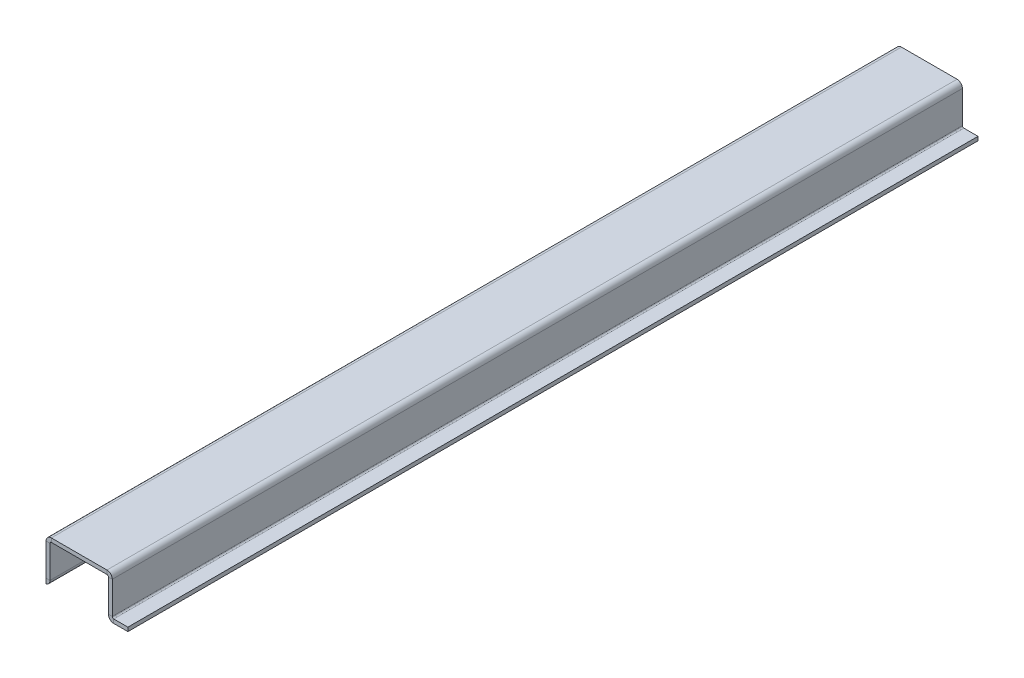
ISO-10303-21;
HEADER;
FILE_DESCRIPTION(('STEP AP214'),'2;1');
FILE_NAME('part.step','',(''),(''),'','','');
FILE_SCHEMA(('AUTOMOTIVE_DESIGN { 1 0 10303 214 1 1 1 1 }'));
ENDSEC;
DATA;
#1=APPLICATION_CONTEXT('core data for automotive mechanical design processes');
#2=APPLICATION_PROTOCOL_DEFINITION('international standard','automotive_design',2000,#1);
#3=PRODUCT_CONTEXT('',#1,'mechanical');
#4=PRODUCT('Part','Part','',(#3));
#5=PRODUCT_RELATED_PRODUCT_CATEGORY('part','',(#4));
#6=PRODUCT_DEFINITION_FORMATION('','',#4);
#7=PRODUCT_DEFINITION_CONTEXT('part definition',#1,'design');
#8=PRODUCT_DEFINITION('design','',#6,#7);
#9=PRODUCT_DEFINITION_SHAPE('','',#8);
#10=(LENGTH_UNIT() NAMED_UNIT(*) SI_UNIT(.MILLI.,.METRE.));
#11=(NAMED_UNIT(*) PLANE_ANGLE_UNIT() SI_UNIT($,.RADIAN.));
#12=(NAMED_UNIT(*) SI_UNIT($,.STERADIAN.) SOLID_ANGLE_UNIT());
#13=UNCERTAINTY_MEASURE_WITH_UNIT(LENGTH_MEASURE(1.E-05),#10,'distance_accuracy_value','');
#14=(GEOMETRIC_REPRESENTATION_CONTEXT(3) GLOBAL_UNCERTAINTY_ASSIGNED_CONTEXT((#13)) GLOBAL_UNIT_ASSIGNED_CONTEXT((#10,
#11,#12)) REPRESENTATION_CONTEXT('',''));
#15=CARTESIAN_POINT('',(0.,0.,0.));
#16=DIRECTION('',(0.,0.,1.));
#17=DIRECTION('',(1.,0.,0.));
#18=AXIS2_PLACEMENT_3D('',#15,#16,#17);
#19=CARTESIAN_POINT('',(0.,2.,436.));
#20=DIRECTION('',(0.,-1.,0.));
#21=DIRECTION('',(1.,0.,0.));
#22=AXIS2_PLACEMENT_3D('',#19,#20,#21);
#23=PLANE('',#22);
#24=DIRECTION('',(-1.,0.,0.));
#25=VECTOR('',#24,1.);
#26=CARTESIAN_POINT('',(0.,2.,360.));
#27=LINE('',#26,#25);
#28=CARTESIAN_POINT('',(-2.7366,2.,360.));
#29=VERTEX_POINT('',#28);
#30=CARTESIAN_POINT('',(-10.,2.,360.));
#31=VERTEX_POINT('',#30);
#32=EDGE_CURVE('E204',#29,#31,#27,.T.);
#33=ORIENTED_EDGE('',*,*,#32,.F.);
#34=DIRECTION('',(0.,0.,-1.));
#35=VECTOR('',#34,1.);
#36=CARTESIAN_POINT('',(-2.7366,2.,436.));
#37=LINE('',#36,#35);
#38=CARTESIAN_POINT('',(-2.7366,2.,76.));
#39=VERTEX_POINT('',#38);
#40=EDGE_CURVE('E203',#29,#39,#37,.T.);
#41=ORIENTED_EDGE('',*,*,#40,.T.);
#42=DIRECTION('',(1.,0.,0.));
#43=VECTOR('',#42,1.);
#44=CARTESIAN_POINT('',(3.88761203946308E-13,2.,76.));
#45=LINE('',#44,#43);
#46=CARTESIAN_POINT('',(-10.,2.,76.));
#47=VERTEX_POINT('',#46);
#48=EDGE_CURVE('E300',#47,#39,#45,.T.);
#49=ORIENTED_EDGE('',*,*,#48,.F.);
#50=DIRECTION('',(0.,0.,-1.));
#51=VECTOR('',#50,1.);
#52=CARTESIAN_POINT('',(-10.,2.,436.));
#53=LINE('',#52,#51);
#54=EDGE_CURVE('E262',#31,#47,#53,.T.);
#55=ORIENTED_EDGE('',*,*,#54,.F.);
#56=EDGE_LOOP('',(#33,#41,#49,#55));
#57=FACE_BOUND('',#56,.T.);
#58=ADVANCED_FACE('F38',(#57),#23,.F.);
#59=CARTESIAN_POINT('',(-10.,0.,436.));
#60=DIRECTION('',(-1.,0.,0.));
#61=DIRECTION('',(0.,0.,1.));
#62=AXIS2_PLACEMENT_3D('',#59,#60,#61);
#63=PLANE('',#62);
#64=DIRECTION('',(0.,0.,-1.));
#65=VECTOR('',#64,1.);
#66=CARTESIAN_POINT('',(-10.,0.,436.));
#67=LINE('',#66,#65);
#68=CARTESIAN_POINT('',(-10.,0.,360.));
#69=VERTEX_POINT('',#68);
#70=CARTESIAN_POINT('',(-10.,0.,76.));
#71=VERTEX_POINT('',#70);
#72=EDGE_CURVE('E260',#69,#71,#67,.T.);
#73=ORIENTED_EDGE('',*,*,#72,.F.);
#74=DIRECTION('',(0.,1.,0.));
#75=VECTOR('',#74,1.);
#76=CARTESIAN_POINT('',(-10.,0.,360.));
#77=LINE('',#76,#75);
#78=EDGE_CURVE('E906',#69,#31,#77,.T.);
#79=ORIENTED_EDGE('',*,*,#78,.T.);
#80=ORIENTED_EDGE('',*,*,#54,.T.);
#81=DIRECTION('',(0.,-1.,0.));
#82=VECTOR('',#81,1.);
#83=CARTESIAN_POINT('',(-10.,0.,76.));
#84=LINE('',#83,#82);
#85=EDGE_CURVE('E302',#47,#71,#84,.T.);
#86=ORIENTED_EDGE('',*,*,#85,.T.);
#87=EDGE_LOOP('',(#73,#79,#80,#86));
#88=FACE_BOUND('',#87,.T.);
#89=ADVANCED_FACE('F519',(#88),#63,.T.);
#90=CARTESIAN_POINT('',(0.,0.,436.));
#91=DIRECTION('',(0.,-1.,0.));
#92=DIRECTION('',(1.,0.,0.));
#93=AXIS2_PLACEMENT_3D('',#90,#91,#92);
#94=PLANE('',#93);
#95=DIRECTION('',(0.,0.,-1.));
#96=VECTOR('',#95,1.);
#97=CARTESIAN_POINT('',(-2.7366,0.,436.));
#98=LINE('',#97,#96);
#99=CARTESIAN_POINT('',(-2.7366,0.,360.));
#100=VERTEX_POINT('',#99);
#101=CARTESIAN_POINT('',(-2.7366,0.,76.));
#102=VERTEX_POINT('',#101);
#103=EDGE_CURVE('E258',#100,#102,#98,.T.);
#104=ORIENTED_EDGE('',*,*,#103,.F.);
#105=DIRECTION('',(-1.,0.,0.));
#106=VECTOR('',#105,1.);
#107=CARTESIAN_POINT('',(0.,0.,360.));
#108=LINE('',#107,#106);
#109=EDGE_CURVE('E903',#100,#69,#108,.T.);
#110=ORIENTED_EDGE('',*,*,#109,.T.);
#111=ORIENTED_EDGE('',*,*,#72,.T.);
#112=DIRECTION('',(1.,0.,0.));
#113=VECTOR('',#112,1.);
#114=CARTESIAN_POINT('',(3.89006133306138E-13,0.,76.));
#115=LINE('',#114,#113);
#116=EDGE_CURVE('E307',#71,#102,#115,.T.);
#117=ORIENTED_EDGE('',*,*,#116,.T.);
#118=EDGE_LOOP('',(#104,#110,#111,#117));
#119=FACE_BOUND('',#118,.T.);
#120=ADVANCED_FACE('F525',(#119),#94,.T.);
#121=CARTESIAN_POINT('',(-2.7366,2.7366,436.));
#122=DIRECTION('',(0.,0.,-1.));
#123=DIRECTION('',(-1.,0.,0.));
#124=AXIS2_PLACEMENT_3D('',#121,#122,#123);
#125=CYLINDRICAL_SURFACE('',#124,2.7366);
#126=CARTESIAN_POINT('',(-2.7366,2.7366,436.));
#127=DIRECTION('',(0.,0.,1.));
#128=DIRECTION('',(1.,0.,0.));
#129=AXIS2_PLACEMENT_3D('',#126,#127,#128);
#130=CIRCLE('',#129,2.7366);
#131=CARTESIAN_POINT('',(0.,2.7366,436.));
#132=VERTEX_POINT('',#131);
#133=CARTESIAN_POINT('',(-2.,0.100997602065136,436.));
#134=VERTEX_POINT('',#133);
#135=EDGE_CURVE('E319',#132,#134,#130,.F.);
#136=ORIENTED_EDGE('',*,*,#135,.T.);
#137=DIRECTION('',(0.,0.,-1.));
#138=VECTOR('',#137,1.);
#139=CARTESIAN_POINT('',(-2.,0.100997602065136,436.));
#140=LINE('',#139,#138);
#141=CARTESIAN_POINT('',(-2.,0.100997602065137,360.));
#142=VERTEX_POINT('',#141);
#143=EDGE_CURVE('E53',#134,#142,#140,.T.);
#144=ORIENTED_EDGE('',*,*,#143,.T.);
#145=CARTESIAN_POINT('',(-2.7366,2.7366,360.));
#146=DIRECTION('',(0.,0.,1.));
#147=DIRECTION('',(1.,0.,0.));
#148=AXIS2_PLACEMENT_3D('',#145,#146,#147);
#149=CIRCLE('',#148,2.7366);
#150=EDGE_CURVE('E199',#142,#100,#149,.F.);
#151=ORIENTED_EDGE('',*,*,#150,.T.);
#152=ORIENTED_EDGE('',*,*,#103,.T.);
#153=CARTESIAN_POINT('',(-2.7366,2.7366,76.));
#154=DIRECTION('',(0.,0.,-1.));
#155=DIRECTION('',(-1.,0.,0.));
#156=AXIS2_PLACEMENT_3D('',#153,#154,#155);
#157=CIRCLE('',#156,2.7366);
#158=CARTESIAN_POINT('',(-2.,0.100997602065131,76.));
#159=VERTEX_POINT('',#158);
#160=EDGE_CURVE('E316',#102,#159,#157,.F.);
#161=ORIENTED_EDGE('',*,*,#160,.T.);
#162=DIRECTION('',(0.,0.,-1.));
#163=VECTOR('',#162,1.);
#164=CARTESIAN_POINT('',(-2.00000000000002,0.100997602065131,436.));
#165=LINE('',#164,#163);
#166=CARTESIAN_POINT('',(-2.00000000000002,0.100997602065131,0.));
#167=VERTEX_POINT('',#166);
#168=EDGE_CURVE('E310',#159,#167,#165,.T.);
#169=ORIENTED_EDGE('',*,*,#168,.T.);
#170=CARTESIAN_POINT('',(-2.7366,2.7366,0.));
#171=DIRECTION('',(0.,0.,1.));
#172=DIRECTION('',(1.,0.,0.));
#173=AXIS2_PLACEMENT_3D('',#170,#171,#172);
#174=CIRCLE('',#173,2.7366);
#175=CARTESIAN_POINT('',(0.,2.7366,0.));
#176=VERTEX_POINT('',#175);
#177=EDGE_CURVE('E318',#176,#167,#174,.F.);
#178=ORIENTED_EDGE('',*,*,#177,.F.);
#179=DIRECTION('',(0.,0.,-1.));
#180=VECTOR('',#179,1.);
#181=CARTESIAN_POINT('',(0.,2.7366,436.));
#182=LINE('',#181,#180);
#183=EDGE_CURVE('E255',#132,#176,#182,.T.);
#184=ORIENTED_EDGE('',*,*,#183,.F.);
#185=EDGE_LOOP('',(#136,#144,#151,#152,#161,#169,#178,#184));
#186=FACE_BOUND('',#185,.T.);
#187=ADVANCED_FACE('F507',(#186),#125,.T.);
#188=CARTESIAN_POINT('',(-2.7366,2.7366,436.));
#189=DIRECTION('',(0.,0.,-1.));
#190=DIRECTION('',(-1.,0.,0.));
#191=AXIS2_PLACEMENT_3D('',#188,#189,#190);
#192=CYLINDRICAL_SURFACE('',#191,0.7366);
#193=CARTESIAN_POINT('',(-2.7366,2.7366,360.));
#194=DIRECTION('',(0.,0.,1.));
#195=DIRECTION('',(1.,0.,0.));
#196=AXIS2_PLACEMENT_3D('',#193,#194,#195);
#197=CIRCLE('',#196,0.7366);
#198=CARTESIAN_POINT('',(-2.,2.7366,360.));
#199=VERTEX_POINT('',#198);
#200=EDGE_CURVE('E196',#199,#29,#197,.F.);
#201=ORIENTED_EDGE('',*,*,#200,.F.);
#202=DIRECTION('',(0.,0.,-1.));
#203=VECTOR('',#202,1.);
#204=CARTESIAN_POINT('',(-2.,2.7366,436.));
#205=LINE('',#204,#203);
#206=CARTESIAN_POINT('',(-2.,2.7366,76.));
#207=VERTEX_POINT('',#206);
#208=EDGE_CURVE('E60',#199,#207,#205,.T.);
#209=ORIENTED_EDGE('',*,*,#208,.T.);
#210=CARTESIAN_POINT('',(-2.7366,2.7366,76.));
#211=DIRECTION('',(0.,0.,-1.));
#212=DIRECTION('',(-1.,0.,0.));
#213=AXIS2_PLACEMENT_3D('',#210,#211,#212);
#214=CIRCLE('',#213,0.7366);
#215=EDGE_CURVE('E46',#39,#207,#214,.F.);
#216=ORIENTED_EDGE('',*,*,#215,.F.);
#217=ORIENTED_EDGE('',*,*,#40,.F.);
#218=EDGE_LOOP('',(#201,#209,#216,#217));
#219=FACE_BOUND('',#218,.T.);
#220=ADVANCED_FACE('F202',(#219),#192,.F.);
#221=CARTESIAN_POINT('',(-2.7366,0.,436.));
#222=DIRECTION('',(0.,0.,1.));
#223=DIRECTION('',(1.,0.,0.));
#224=AXIS2_PLACEMENT_3D('',#221,#222,#223);
#225=PLANE('',#224);
#226=DIRECTION('',(1.,0.,0.));
#227=VECTOR('',#226,1.);
#228=CARTESIAN_POINT('',(-2.,2.7366,436.));
#229=LINE('',#228,#227);
#230=CARTESIAN_POINT('',(-2.,2.7366,436.));
#231=VERTEX_POINT('',#230);
#232=EDGE_CURVE('E267',#231,#132,#229,.T.);
#233=ORIENTED_EDGE('',*,*,#232,.F.);
#234=DIRECTION('',(0.,-1.,0.));
#235=VECTOR('',#234,1.);
#236=CARTESIAN_POINT('',(-2.,0.,436.));
#237=LINE('',#236,#235);
#238=EDGE_CURVE('E11',#231,#134,#237,.T.);
#239=ORIENTED_EDGE('',*,*,#238,.T.);
#240=ORIENTED_EDGE('',*,*,#135,.F.);
#241=EDGE_LOOP('',(#233,#239,#240));
#242=FACE_BOUND('',#241,.T.);
#243=ADVANCED_FACE('F508',(#242),#225,.T.);
#244=CARTESIAN_POINT('',(0.,2.7366,0.));
#245=DIRECTION('',(0.,0.,-1.));
#246=DIRECTION('',(-1.,0.,0.));
#247=AXIS2_PLACEMENT_3D('',#244,#245,#246);
#248=PLANE('',#247);
#249=ORIENTED_EDGE('',*,*,#177,.T.);
#250=DIRECTION('',(0.,1.,0.));
#251=VECTOR('',#250,1.);
#252=CARTESIAN_POINT('',(-2.,2.7366,0.));
#253=LINE('',#252,#251);
#254=CARTESIAN_POINT('',(-2.00000000000001,2.7366,0.));
#255=VERTEX_POINT('',#254);
#256=EDGE_CURVE('E305',#167,#255,#253,.T.);
#257=ORIENTED_EDGE('',*,*,#256,.T.);
#258=DIRECTION('',(-1.,0.,0.));
#259=VECTOR('',#258,1.);
#260=CARTESIAN_POINT('',(0.,2.7366,0.));
#261=LINE('',#260,#259);
#262=EDGE_CURVE('E264',#176,#255,#261,.T.);
#263=ORIENTED_EDGE('',*,*,#262,.F.);
#264=EDGE_LOOP('',(#249,#257,#263));
#265=FACE_BOUND('',#264,.T.);
#266=ADVANCED_FACE('F415',(#265),#248,.T.);
#267=CARTESIAN_POINT('',(30.,2.7366,436.));
#268=DIRECTION('',(0.,0.,1.));
#269=DIRECTION('',(1.,0.,0.));
#270=AXIS2_PLACEMENT_3D('',#267,#268,#269);
#271=PLANE('',#270);
#272=DIRECTION('',(1.,0.,0.));
#273=VECTOR('',#272,1.);
#274=CARTESIAN_POINT('',(30.,2.7366,436.));
#275=LINE('',#274,#273);
#276=CARTESIAN_POINT('',(30.,2.7366,436.));
#277=VERTEX_POINT('',#276);
#278=CARTESIAN_POINT('',(32.,2.7366,436.));
#279=VERTEX_POINT('',#278);
#280=EDGE_CURVE('E291',#277,#279,#275,.T.);
#281=ORIENTED_EDGE('',*,*,#280,.F.);
#282=CARTESIAN_POINT('',(32.7366,2.7366,436.));
#283=DIRECTION('',(0.,0.,1.));
#284=DIRECTION('',(1.,0.,0.));
#285=AXIS2_PLACEMENT_3D('',#282,#283,#284);
#286=CIRCLE('',#285,2.7366);
#287=CARTESIAN_POINT('',(32.7366,0.,436.));
#288=VERTEX_POINT('',#287);
#289=EDGE_CURVE('E338',#288,#277,#286,.F.);
#290=ORIENTED_EDGE('',*,*,#289,.F.);
#291=DIRECTION('',(0.,-1.,0.));
#292=VECTOR('',#291,1.);
#293=CARTESIAN_POINT('',(32.7366,2.,436.));
#294=LINE('',#293,#292);
#295=CARTESIAN_POINT('',(32.7366,2.,436.));
#296=VERTEX_POINT('',#295);
#297=EDGE_CURVE('E289',#296,#288,#294,.T.);
#298=ORIENTED_EDGE('',*,*,#297,.F.);
#299=CARTESIAN_POINT('',(32.7366,2.7366,436.));
#300=DIRECTION('',(0.,0.,1.));
#301=DIRECTION('',(1.,0.,0.));
#302=AXIS2_PLACEMENT_3D('',#299,#300,#301);
#303=CIRCLE('',#302,0.7366);
#304=EDGE_CURVE('E350',#296,#279,#303,.F.);
#305=ORIENTED_EDGE('',*,*,#304,.T.);
#306=EDGE_LOOP('',(#281,#290,#298,#305));
#307=FACE_BOUND('',#306,.T.);
#308=ADVANCED_FACE('F40',(#307),#271,.T.);
#309=CARTESIAN_POINT('',(32.7366,2.,436.));
#310=DIRECTION('',(0.,0.,1.));
#311=DIRECTION('',(1.,0.,0.));
#312=AXIS2_PLACEMENT_3D('',#309,#310,#311);
#313=PLANE('',#312);
#314=DIRECTION('',(0.,1.,0.));
#315=VECTOR('',#314,1.);
#316=CARTESIAN_POINT('',(30.,20.,436.));
#317=LINE('',#316,#315);
#318=CARTESIAN_POINT('',(30.,19.2634,436.));
#319=VERTEX_POINT('',#318);
#320=EDGE_CURVE('E335',#277,#319,#317,.T.);
#321=ORIENTED_EDGE('',*,*,#320,.F.);
#322=ORIENTED_EDGE('',*,*,#280,.T.);
#323=DIRECTION('',(0.,1.,0.));
#324=VECTOR('',#323,1.);
#325=CARTESIAN_POINT('',(32.,20.,436.));
#326=LINE('',#325,#324);
#327=CARTESIAN_POINT('',(32.,19.2634,436.));
#328=VERTEX_POINT('',#327);
#329=EDGE_CURVE('E353',#279,#328,#326,.T.);
#330=ORIENTED_EDGE('',*,*,#329,.T.);
#331=DIRECTION('',(-1.,0.,0.));
#332=VECTOR('',#331,1.);
#333=CARTESIAN_POINT('',(32.,19.2634,436.));
#334=LINE('',#333,#332);
#335=EDGE_CURVE('E281',#328,#319,#334,.T.);
#336=ORIENTED_EDGE('',*,*,#335,.T.);
#337=EDGE_LOOP('',(#321,#322,#330,#336));
#338=FACE_BOUND('',#337,.T.);
#339=ADVANCED_FACE('F488',(#338),#313,.T.);
#340=CARTESIAN_POINT('',(32.7366,0.,0.));
#341=DIRECTION('',(0.,0.,-1.));
#342=DIRECTION('',(-1.,0.,0.));
#343=AXIS2_PLACEMENT_3D('',#340,#341,#342);
#344=PLANE('',#343);
#345=DIRECTION('',(0.,1.,0.));
#346=VECTOR('',#345,1.);
#347=CARTESIAN_POINT('',(32.7366,0.,0.));
#348=LINE('',#347,#346);
#349=CARTESIAN_POINT('',(32.7366,0.,0.));
#350=VERTEX_POINT('',#349);
#351=CARTESIAN_POINT('',(32.7366,2.,0.));
#352=VERTEX_POINT('',#351);
#353=EDGE_CURVE('E287',#350,#352,#348,.T.);
#354=ORIENTED_EDGE('',*,*,#353,.F.);
#355=CARTESIAN_POINT('',(32.7366,2.7366,0.));
#356=DIRECTION('',(0.,0.,1.));
#357=DIRECTION('',(1.,0.,0.));
#358=AXIS2_PLACEMENT_3D('',#355,#356,#357);
#359=CIRCLE('',#358,2.7366);
#360=CARTESIAN_POINT('',(30.,2.7366,0.));
#361=VERTEX_POINT('',#360);
#362=EDGE_CURVE('E383',#350,#361,#359,.F.);
#363=ORIENTED_EDGE('',*,*,#362,.T.);
#364=DIRECTION('',(-1.,0.,0.));
#365=VECTOR('',#364,1.);
#366=CARTESIAN_POINT('',(32.,2.7366,0.));
#367=LINE('',#366,#365);
#368=CARTESIAN_POINT('',(32.,2.7366,0.));
#369=VERTEX_POINT('',#368);
#370=EDGE_CURVE('E285',#369,#361,#367,.T.);
#371=ORIENTED_EDGE('',*,*,#370,.F.);
#372=CARTESIAN_POINT('',(32.7366,2.7366,0.));
#373=DIRECTION('',(0.,0.,1.));
#374=DIRECTION('',(1.,0.,0.));
#375=AXIS2_PLACEMENT_3D('',#372,#373,#374);
#376=CIRCLE('',#375,0.7366);
#377=EDGE_CURVE('E395',#352,#369,#376,.F.);
#378=ORIENTED_EDGE('',*,*,#377,.F.);
#379=EDGE_LOOP('',(#354,#363,#371,#378));
#380=FACE_BOUND('',#379,.T.);
#381=ADVANCED_FACE('F458',(#380),#344,.T.);
#382=CARTESIAN_POINT('',(32.,2.7366,0.));
#383=DIRECTION('',(0.,0.,-1.));
#384=DIRECTION('',(-1.,0.,0.));
#385=AXIS2_PLACEMENT_3D('',#382,#383,#384);
#386=PLANE('',#385);
#387=DIRECTION('',(-1.,0.,0.));
#388=VECTOR('',#387,1.);
#389=CARTESIAN_POINT('',(30.,0.,0.));
#390=LINE('',#389,#388);
#391=CARTESIAN_POINT('',(40.,0.,0.));
#392=VERTEX_POINT('',#391);
#393=EDGE_CURVE('E386',#392,#350,#390,.T.);
#394=ORIENTED_EDGE('',*,*,#393,.T.);
#395=ORIENTED_EDGE('',*,*,#353,.T.);
#396=DIRECTION('',(-1.,0.,0.));
#397=VECTOR('',#396,1.);
#398=CARTESIAN_POINT('',(30.,2.00000000000001,0.));
#399=LINE('',#398,#397);
#400=CARTESIAN_POINT('',(40.,2.,0.));
#401=VERTEX_POINT('',#400);
#402=EDGE_CURVE('E392',#401,#352,#399,.T.);
#403=ORIENTED_EDGE('',*,*,#402,.F.);
#404=DIRECTION('',(0.,-1.,0.));
#405=VECTOR('',#404,1.);
#406=CARTESIAN_POINT('',(40.,2.,0.));
#407=LINE('',#406,#405);
#408=EDGE_CURVE('E389',#401,#392,#407,.T.);
#409=ORIENTED_EDGE('',*,*,#408,.T.);
#410=EDGE_LOOP('',(#394,#395,#403,#409));
#411=FACE_BOUND('',#410,.T.);
#412=ADVANCED_FACE('F466',(#411),#386,.T.);
#413=CARTESIAN_POINT('',(29.2634,20.,436.));
#414=DIRECTION('',(0.,0.,1.));
#415=DIRECTION('',(1.,0.,0.));
#416=AXIS2_PLACEMENT_3D('',#413,#414,#415);
#417=PLANE('',#416);
#418=DIRECTION('',(0.,1.,0.));
#419=VECTOR('',#418,1.);
#420=CARTESIAN_POINT('',(29.2634,20.,436.));
#421=LINE('',#420,#419);
#422=CARTESIAN_POINT('',(29.2634,20.,436.));
#423=VERTEX_POINT('',#422);
#424=CARTESIAN_POINT('',(29.2634,22.,436.));
#425=VERTEX_POINT('',#424);
#426=EDGE_CURVE('E283',#423,#425,#421,.T.);
#427=ORIENTED_EDGE('',*,*,#426,.F.);
#428=CARTESIAN_POINT('',(29.2634,19.2634,436.));
#429=DIRECTION('',(0.,0.,-1.));
#430=DIRECTION('',(-1.,0.,0.));
#431=AXIS2_PLACEMENT_3D('',#428,#429,#430);
#432=CIRCLE('',#431,0.7366);
#433=EDGE_CURVE('E332',#319,#423,#432,.F.);
#434=ORIENTED_EDGE('',*,*,#433,.F.);
#435=ORIENTED_EDGE('',*,*,#335,.F.);
#436=CARTESIAN_POINT('',(29.2634,19.2634,436.));
#437=DIRECTION('',(0.,0.,1.));
#438=DIRECTION('',(1.,0.,0.));
#439=AXIS2_PLACEMENT_3D('',#436,#437,#438);
#440=CIRCLE('',#439,2.7366);
#441=EDGE_CURVE('E356',#328,#425,#440,.T.);
#442=ORIENTED_EDGE('',*,*,#441,.T.);
#443=EDGE_LOOP('',(#427,#434,#435,#442));
#444=FACE_BOUND('',#443,.T.);
#445=ADVANCED_FACE('F491',(#444),#417,.T.);
#446=CARTESIAN_POINT('',(32.,19.2634,436.));
#447=DIRECTION('',(0.,0.,1.));
#448=DIRECTION('',(1.,0.,0.));
#449=AXIS2_PLACEMENT_3D('',#446,#447,#448);
#450=PLANE('',#449);
#451=DIRECTION('',(-1.,0.,0.));
#452=VECTOR('',#451,1.);
#453=CARTESIAN_POINT('',(0.,20.,436.));
#454=LINE('',#453,#452);
#455=CARTESIAN_POINT('',(0.7366,20.,436.));
#456=VERTEX_POINT('',#455);
#457=EDGE_CURVE('E329',#423,#456,#454,.T.);
#458=ORIENTED_EDGE('',*,*,#457,.F.);
#459=ORIENTED_EDGE('',*,*,#426,.T.);
#460=DIRECTION('',(-1.,0.,0.));
#461=VECTOR('',#460,1.);
#462=CARTESIAN_POINT('',(0.,22.,436.));
#463=LINE('',#462,#461);
#464=CARTESIAN_POINT('',(0.736599999999999,22.,436.));
#465=VERTEX_POINT('',#464);
#466=EDGE_CURVE('E359',#425,#465,#463,.T.);
#467=ORIENTED_EDGE('',*,*,#466,.T.);
#468=DIRECTION('',(0.,-1.,0.));
#469=VECTOR('',#468,1.);
#470=CARTESIAN_POINT('',(0.736599999999999,22.,436.));
#471=LINE('',#470,#469);
#472=EDGE_CURVE('E273',#465,#456,#471,.T.);
#473=ORIENTED_EDGE('',*,*,#472,.T.);
#474=EDGE_LOOP('',(#458,#459,#467,#473));
#475=FACE_BOUND('',#474,.T.);
#476=ADVANCED_FACE('F495',(#475),#450,.T.);
#477=CARTESIAN_POINT('',(30.,19.2634,0.));
#478=DIRECTION('',(0.,0.,-1.));
#479=DIRECTION('',(-1.,0.,0.));
#480=AXIS2_PLACEMENT_3D('',#477,#478,#479);
#481=PLANE('',#480);
#482=DIRECTION('',(1.,0.,0.));
#483=VECTOR('',#482,1.);
#484=CARTESIAN_POINT('',(30.,19.2634,0.));
#485=LINE('',#484,#483);
#486=CARTESIAN_POINT('',(30.,19.2634,0.));
#487=VERTEX_POINT('',#486);
#488=CARTESIAN_POINT('',(32.,19.2634,0.));
#489=VERTEX_POINT('',#488);
#490=EDGE_CURVE('E279',#487,#489,#485,.T.);
#491=ORIENTED_EDGE('',*,*,#490,.F.);
#492=CARTESIAN_POINT('',(29.2634,19.2634,0.));
#493=DIRECTION('',(0.,0.,-1.));
#494=DIRECTION('',(-1.,0.,0.));
#495=AXIS2_PLACEMENT_3D('',#492,#493,#494);
#496=CIRCLE('',#495,0.7366);
#497=CARTESIAN_POINT('',(29.2634,20.,0.));
#498=VERTEX_POINT('',#497);
#499=EDGE_CURVE('E377',#487,#498,#496,.F.);
#500=ORIENTED_EDGE('',*,*,#499,.T.);
#501=DIRECTION('',(0.,-1.,0.));
#502=VECTOR('',#501,1.);
#503=CARTESIAN_POINT('',(29.2634,22.,0.));
#504=LINE('',#503,#502);
#505=CARTESIAN_POINT('',(29.2634,22.,0.));
#506=VERTEX_POINT('',#505);
#507=EDGE_CURVE('E277',#506,#498,#504,.T.);
#508=ORIENTED_EDGE('',*,*,#507,.F.);
#509=CARTESIAN_POINT('',(29.2634,19.2634,0.));
#510=DIRECTION('',(0.,0.,1.));
#511=DIRECTION('',(1.,0.,0.));
#512=AXIS2_PLACEMENT_3D('',#509,#510,#511);
#513=CIRCLE('',#512,2.7366);
#514=EDGE_CURVE('E401',#489,#506,#513,.T.);
#515=ORIENTED_EDGE('',*,*,#514,.F.);
#516=EDGE_LOOP('',(#491,#500,#508,#515));
#517=FACE_BOUND('',#516,.T.);
#518=ADVANCED_FACE('F442',(#517),#481,.T.);
#519=CARTESIAN_POINT('',(29.2634,22.,0.));
#520=DIRECTION('',(0.,0.,-1.));
#521=DIRECTION('',(-1.,0.,0.));
#522=AXIS2_PLACEMENT_3D('',#519,#520,#521);
#523=PLANE('',#522);
#524=DIRECTION('',(0.,1.,0.));
#525=VECTOR('',#524,1.);
#526=CARTESIAN_POINT('',(30.,20.,0.));
#527=LINE('',#526,#525);
#528=EDGE_CURVE('E380',#361,#487,#527,.T.);
#529=ORIENTED_EDGE('',*,*,#528,.T.);
#530=ORIENTED_EDGE('',*,*,#490,.T.);
#531=DIRECTION('',(0.,1.,0.));
#532=VECTOR('',#531,1.);
#533=CARTESIAN_POINT('',(32.,20.,0.));
#534=LINE('',#533,#532);
#535=EDGE_CURVE('E398',#369,#489,#534,.T.);
#536=ORIENTED_EDGE('',*,*,#535,.F.);
#537=ORIENTED_EDGE('',*,*,#370,.T.);
#538=EDGE_LOOP('',(#529,#530,#536,#537));
#539=FACE_BOUND('',#538,.T.);
#540=ADVANCED_FACE('F450',(#539),#523,.T.);
#541=CARTESIAN_POINT('',(0.,19.2634,436.));
#542=DIRECTION('',(0.,0.,1.));
#543=DIRECTION('',(1.,0.,0.));
#544=AXIS2_PLACEMENT_3D('',#541,#542,#543);
#545=PLANE('',#544);
#546=DIRECTION('',(-1.,0.,0.));
#547=VECTOR('',#546,1.);
#548=CARTESIAN_POINT('',(0.,19.2634,436.));
#549=LINE('',#548,#547);
#550=CARTESIAN_POINT('',(0.,19.2634,436.));
#551=VERTEX_POINT('',#550);
#552=CARTESIAN_POINT('',(-2.,19.2634,436.));
#553=VERTEX_POINT('',#552);
#554=EDGE_CURVE('E275',#551,#553,#549,.T.);
#555=ORIENTED_EDGE('',*,*,#554,.F.);
#556=CARTESIAN_POINT('',(0.7366,19.2634,436.));
#557=DIRECTION('',(0.,0.,-1.));
#558=DIRECTION('',(-1.,0.,0.));
#559=AXIS2_PLACEMENT_3D('',#556,#557,#558);
#560=CIRCLE('',#559,0.7366);
#561=EDGE_CURVE('E326',#456,#551,#560,.F.);
#562=ORIENTED_EDGE('',*,*,#561,.F.);
#563=ORIENTED_EDGE('',*,*,#472,.F.);
#564=CARTESIAN_POINT('',(0.7366,19.2634,436.));
#565=DIRECTION('',(0.,0.,1.));
#566=DIRECTION('',(1.,0.,0.));
#567=AXIS2_PLACEMENT_3D('',#564,#565,#566);
#568=CIRCLE('',#567,2.7366);
#569=EDGE_CURVE('E362',#465,#553,#568,.T.);
#570=ORIENTED_EDGE('',*,*,#569,.T.);
#571=EDGE_LOOP('',(#555,#562,#563,#570));
#572=FACE_BOUND('',#571,.T.);
#573=ADVANCED_FACE('F499',(#572),#545,.T.);
#574=CARTESIAN_POINT('',(0.736599999999999,22.,436.));
#575=DIRECTION('',(0.,0.,1.));
#576=DIRECTION('',(1.,0.,0.));
#577=AXIS2_PLACEMENT_3D('',#574,#575,#576);
#578=PLANE('',#577);
#579=DIRECTION('',(0.,-1.,0.));
#580=VECTOR('',#579,1.);
#581=CARTESIAN_POINT('',(0.,0.,436.));
#582=LINE('',#581,#580);
#583=EDGE_CURVE('E322',#551,#132,#582,.T.);
#584=ORIENTED_EDGE('',*,*,#583,.F.);
#585=ORIENTED_EDGE('',*,*,#554,.T.);
#586=DIRECTION('',(0.,1.,0.));
#587=VECTOR('',#586,1.);
#588=CARTESIAN_POINT('',(-2.,0.,436.));
#589=LINE('',#588,#587);
#590=EDGE_CURVE('E215',#553,#231,#589,.F.);
#591=ORIENTED_EDGE('',*,*,#590,.T.);
#592=ORIENTED_EDGE('',*,*,#232,.T.);
#593=EDGE_LOOP('',(#584,#585,#591,#592));
#594=FACE_BOUND('',#593,.T.);
#595=ADVANCED_FACE('F502',(#594),#578,.T.);
#596=CARTESIAN_POINT('',(0.7366,20.,0.));
#597=DIRECTION('',(0.,0.,-1.));
#598=DIRECTION('',(-1.,0.,0.));
#599=AXIS2_PLACEMENT_3D('',#596,#597,#598);
#600=PLANE('',#599);
#601=DIRECTION('',(0.,1.,0.));
#602=VECTOR('',#601,1.);
#603=CARTESIAN_POINT('',(0.7366,20.,0.));
#604=LINE('',#603,#602);
#605=CARTESIAN_POINT('',(0.7366,20.,0.));
#606=VERTEX_POINT('',#605);
#607=CARTESIAN_POINT('',(0.736599999999999,22.,0.));
#608=VERTEX_POINT('',#607);
#609=EDGE_CURVE('E271',#606,#608,#604,.T.);
#610=ORIENTED_EDGE('',*,*,#609,.F.);
#611=CARTESIAN_POINT('',(0.7366,19.2634,0.));
#612=DIRECTION('',(0.,0.,-1.));
#613=DIRECTION('',(-1.,0.,0.));
#614=AXIS2_PLACEMENT_3D('',#611,#612,#613);
#615=CIRCLE('',#614,0.7366);
#616=CARTESIAN_POINT('',(0.,19.2634,0.));
#617=VERTEX_POINT('',#616);
#618=EDGE_CURVE('E371',#606,#617,#615,.F.);
#619=ORIENTED_EDGE('',*,*,#618,.T.);
#620=DIRECTION('',(1.,0.,0.));
#621=VECTOR('',#620,1.);
#622=CARTESIAN_POINT('',(-2.,19.2634,0.));
#623=LINE('',#622,#621);
#624=CARTESIAN_POINT('',(-2.,19.2634,0.));
#625=VERTEX_POINT('',#624);
#626=EDGE_CURVE('E269',#625,#617,#623,.T.);
#627=ORIENTED_EDGE('',*,*,#626,.F.);
#628=CARTESIAN_POINT('',(0.7366,19.2634,0.));
#629=DIRECTION('',(0.,0.,1.));
#630=DIRECTION('',(1.,0.,0.));
#631=AXIS2_PLACEMENT_3D('',#628,#629,#630);
#632=CIRCLE('',#631,2.7366);
#633=EDGE_CURVE('E407',#608,#625,#632,.T.);
#634=ORIENTED_EDGE('',*,*,#633,.F.);
#635=EDGE_LOOP('',(#610,#619,#627,#634));
#636=FACE_BOUND('',#635,.T.);
#637=ADVANCED_FACE('F426',(#636),#600,.T.);
#638=CARTESIAN_POINT('',(-2.,19.2634,0.));
#639=DIRECTION('',(0.,0.,-1.));
#640=DIRECTION('',(-1.,0.,0.));
#641=AXIS2_PLACEMENT_3D('',#638,#639,#640);
#642=PLANE('',#641);
#643=DIRECTION('',(-1.,0.,0.));
#644=VECTOR('',#643,1.);
#645=CARTESIAN_POINT('',(0.,20.,0.));
#646=LINE('',#645,#644);
#647=EDGE_CURVE('E374',#498,#606,#646,.T.);
#648=ORIENTED_EDGE('',*,*,#647,.T.);
#649=ORIENTED_EDGE('',*,*,#609,.T.);
#650=DIRECTION('',(-1.,0.,0.));
#651=VECTOR('',#650,1.);
#652=CARTESIAN_POINT('',(0.,22.,0.));
#653=LINE('',#652,#651);
#654=EDGE_CURVE('E404',#506,#608,#653,.T.);
#655=ORIENTED_EDGE('',*,*,#654,.F.);
#656=ORIENTED_EDGE('',*,*,#507,.T.);
#657=EDGE_LOOP('',(#648,#649,#655,#656));
#658=FACE_BOUND('',#657,.T.);
#659=ADVANCED_FACE('F434',(#658),#642,.T.);
#660=CARTESIAN_POINT('',(-2.7366,2.,0.));
#661=DIRECTION('',(0.,0.,-1.));
#662=DIRECTION('',(-1.,0.,0.));
#663=AXIS2_PLACEMENT_3D('',#660,#661,#662);
#664=PLANE('',#663);
#665=DIRECTION('',(0.,-1.,0.));
#666=VECTOR('',#665,1.);
#667=CARTESIAN_POINT('',(0.,0.,0.));
#668=LINE('',#667,#666);
#669=EDGE_CURVE('E368',#617,#176,#668,.T.);
#670=ORIENTED_EDGE('',*,*,#669,.T.);
#671=ORIENTED_EDGE('',*,*,#262,.T.);
#672=DIRECTION('',(0.,1.,0.));
#673=VECTOR('',#672,1.);
#674=CARTESIAN_POINT('',(-2.,0.,0.));
#675=LINE('',#674,#673);
#676=EDGE_CURVE('E323',#625,#255,#675,.F.);
#677=ORIENTED_EDGE('',*,*,#676,.F.);
#678=ORIENTED_EDGE('',*,*,#626,.T.);
#679=EDGE_LOOP('',(#670,#671,#677,#678));
#680=FACE_BOUND('',#679,.T.);
#681=ADVANCED_FACE('F417',(#680),#664,.T.);
#682=CARTESIAN_POINT('',(0.,0.,436.));
#683=DIRECTION('',(1.,0.,0.));
#684=DIRECTION('',(0.,0.,-1.));
#685=AXIS2_PLACEMENT_3D('',#682,#683,#684);
#686=PLANE('',#685);
#687=ORIENTED_EDGE('',*,*,#669,.F.);
#688=DIRECTION('',(0.,0.,-1.));
#689=VECTOR('',#688,1.);
#690=CARTESIAN_POINT('',(0.,19.2634,436.));
#691=LINE('',#690,#689);
#692=EDGE_CURVE('E252',#551,#617,#691,.T.);
#693=ORIENTED_EDGE('',*,*,#692,.F.);
#694=ORIENTED_EDGE('',*,*,#583,.T.);
#695=ORIENTED_EDGE('',*,*,#183,.T.);
#696=EDGE_LOOP('',(#687,#693,#694,#695));
#697=FACE_BOUND('',#696,.T.);
#698=ADVANCED_FACE('F421',(#697),#686,.T.);
#699=CARTESIAN_POINT('',(0.7366,19.2634,436.));
#700=DIRECTION('',(0.,0.,-1.));
#701=DIRECTION('',(-1.,0.,0.));
#702=AXIS2_PLACEMENT_3D('',#699,#700,#701);
#703=CYLINDRICAL_SURFACE('',#702,0.7366);
#704=ORIENTED_EDGE('',*,*,#618,.F.);
#705=DIRECTION('',(0.,0.,-1.));
#706=VECTOR('',#705,1.);
#707=CARTESIAN_POINT('',(0.7366,20.,436.));
#708=LINE('',#707,#706);
#709=EDGE_CURVE('E249',#456,#606,#708,.T.);
#710=ORIENTED_EDGE('',*,*,#709,.F.);
#711=ORIENTED_EDGE('',*,*,#561,.T.);
#712=ORIENTED_EDGE('',*,*,#692,.T.);
#713=EDGE_LOOP('',(#704,#710,#711,#712));
#714=FACE_BOUND('',#713,.T.);
#715=ADVANCED_FACE('F430',(#714),#703,.F.);
#716=CARTESIAN_POINT('',(0.,20.,436.));
#717=DIRECTION('',(0.,-1.,0.));
#718=DIRECTION('',(1.,0.,0.));
#719=AXIS2_PLACEMENT_3D('',#716,#717,#718);
#720=PLANE('',#719);
#721=ORIENTED_EDGE('',*,*,#647,.F.);
#722=DIRECTION('',(0.,0.,-1.));
#723=VECTOR('',#722,1.);
#724=CARTESIAN_POINT('',(29.2634,20.,436.));
#725=LINE('',#724,#723);
#726=EDGE_CURVE('E246',#423,#498,#725,.T.);
#727=ORIENTED_EDGE('',*,*,#726,.F.);
#728=ORIENTED_EDGE('',*,*,#457,.T.);
#729=ORIENTED_EDGE('',*,*,#709,.T.);
#730=EDGE_LOOP('',(#721,#727,#728,#729));
#731=FACE_BOUND('',#730,.T.);
#732=ADVANCED_FACE('F438',(#731),#720,.T.);
#733=CARTESIAN_POINT('',(29.2634,19.2634,436.));
#734=DIRECTION('',(0.,0.,-1.));
#735=DIRECTION('',(-1.,0.,0.));
#736=AXIS2_PLACEMENT_3D('',#733,#734,#735);
#737=CYLINDRICAL_SURFACE('',#736,0.7366);
#738=ORIENTED_EDGE('',*,*,#499,.F.);
#739=DIRECTION('',(0.,0.,-1.));
#740=VECTOR('',#739,1.);
#741=CARTESIAN_POINT('',(30.,19.2634,436.));
#742=LINE('',#741,#740);
#743=EDGE_CURVE('E243',#319,#487,#742,.T.);
#744=ORIENTED_EDGE('',*,*,#743,.F.);
#745=ORIENTED_EDGE('',*,*,#433,.T.);
#746=ORIENTED_EDGE('',*,*,#726,.T.);
#747=EDGE_LOOP('',(#738,#744,#745,#746));
#748=FACE_BOUND('',#747,.T.);
#749=ADVANCED_FACE('F446',(#748),#737,.F.);
#750=CARTESIAN_POINT('',(30.,20.,436.));
#751=DIRECTION('',(-1.,0.,0.));
#752=DIRECTION('',(0.,0.,1.));
#753=AXIS2_PLACEMENT_3D('',#750,#751,#752);
#754=PLANE('',#753);
#755=ORIENTED_EDGE('',*,*,#528,.F.);
#756=DIRECTION('',(0.,0.,-1.));
#757=VECTOR('',#756,1.);
#758=CARTESIAN_POINT('',(30.,2.7366,436.));
#759=LINE('',#758,#757);
#760=EDGE_CURVE('E240',#277,#361,#759,.T.);
#761=ORIENTED_EDGE('',*,*,#760,.F.);
#762=ORIENTED_EDGE('',*,*,#320,.T.);
#763=ORIENTED_EDGE('',*,*,#743,.T.);
#764=EDGE_LOOP('',(#755,#761,#762,#763));
#765=FACE_BOUND('',#764,.T.);
#766=ADVANCED_FACE('F454',(#765),#754,.T.);
#767=CARTESIAN_POINT('',(32.7366,2.7366,436.));
#768=DIRECTION('',(0.,0.,-1.));
#769=DIRECTION('',(-1.,0.,0.));
#770=AXIS2_PLACEMENT_3D('',#767,#768,#769);
#771=CYLINDRICAL_SURFACE('',#770,2.7366);
#772=ORIENTED_EDGE('',*,*,#362,.F.);
#773=DIRECTION('',(0.,0.,-1.));
#774=VECTOR('',#773,1.);
#775=CARTESIAN_POINT('',(32.7366,0.,436.));
#776=LINE('',#775,#774);
#777=EDGE_CURVE('E237',#288,#350,#776,.T.);
#778=ORIENTED_EDGE('',*,*,#777,.F.);
#779=ORIENTED_EDGE('',*,*,#289,.T.);
#780=ORIENTED_EDGE('',*,*,#760,.T.);
#781=EDGE_LOOP('',(#772,#778,#779,#780));
#782=FACE_BOUND('',#781,.T.);
#783=ADVANCED_FACE('F462',(#782),#771,.T.);
#784=CARTESIAN_POINT('',(30.,0.,436.));
#785=DIRECTION('',(0.,-1.,0.));
#786=DIRECTION('',(1.,0.,0.));
#787=AXIS2_PLACEMENT_3D('',#784,#785,#786);
#788=PLANE('',#787);
#789=ORIENTED_EDGE('',*,*,#393,.F.);
#790=DIRECTION('',(0.,0.,-1.));
#791=VECTOR('',#790,1.);
#792=CARTESIAN_POINT('',(40.,0.,436.));
#793=LINE('',#792,#791);
#794=CARTESIAN_POINT('',(40.,0.,436.));
#795=VERTEX_POINT('',#794);
#796=EDGE_CURVE('E235',#795,#392,#793,.T.);
#797=ORIENTED_EDGE('',*,*,#796,.F.);
#798=DIRECTION('',(-1.,0.,0.));
#799=VECTOR('',#798,1.);
#800=CARTESIAN_POINT('',(30.,0.,436.));
#801=LINE('',#800,#799);
#802=EDGE_CURVE('E341',#795,#288,#801,.T.);
#803=ORIENTED_EDGE('',*,*,#802,.T.);
#804=ORIENTED_EDGE('',*,*,#777,.T.);
#805=EDGE_LOOP('',(#789,#797,#803,#804));
#806=FACE_BOUND('',#805,.T.);
#807=ADVANCED_FACE('F470',(#806),#788,.T.);
#808=CARTESIAN_POINT('',(40.,2.,436.));
#809=DIRECTION('',(1.,0.,0.));
#810=DIRECTION('',(0.,0.,-1.));
#811=AXIS2_PLACEMENT_3D('',#808,#809,#810);
#812=PLANE('',#811);
#813=ORIENTED_EDGE('',*,*,#408,.F.);
#814=DIRECTION('',(0.,0.,-1.));
#815=VECTOR('',#814,1.);
#816=CARTESIAN_POINT('',(40.,2.,436.));
#817=LINE('',#816,#815);
#818=CARTESIAN_POINT('',(40.,2.,436.));
#819=VERTEX_POINT('',#818);
#820=EDGE_CURVE('E233',#819,#401,#817,.T.);
#821=ORIENTED_EDGE('',*,*,#820,.F.);
#822=DIRECTION('',(0.,-1.,0.));
#823=VECTOR('',#822,1.);
#824=CARTESIAN_POINT('',(40.,2.,436.));
#825=LINE('',#824,#823);
#826=EDGE_CURVE('E344',#819,#795,#825,.T.);
#827=ORIENTED_EDGE('',*,*,#826,.T.);
#828=ORIENTED_EDGE('',*,*,#796,.T.);
#829=EDGE_LOOP('',(#813,#821,#827,#828));
#830=FACE_BOUND('',#829,.T.);
#831=ADVANCED_FACE('F476',(#830),#812,.T.);
#832=CARTESIAN_POINT('',(30.,2.00000000000001,436.));
#833=DIRECTION('',(0.,-1.,0.));
#834=DIRECTION('',(1.,0.,0.));
#835=AXIS2_PLACEMENT_3D('',#832,#833,#834);
#836=PLANE('',#835);
#837=ORIENTED_EDGE('',*,*,#402,.T.);
#838=DIRECTION('',(0.,0.,-1.));
#839=VECTOR('',#838,1.);
#840=CARTESIAN_POINT('',(32.7366,2.,436.));
#841=LINE('',#840,#839);
#842=EDGE_CURVE('E230',#296,#352,#841,.T.);
#843=ORIENTED_EDGE('',*,*,#842,.F.);
#844=DIRECTION('',(-1.,0.,0.));
#845=VECTOR('',#844,1.);
#846=CARTESIAN_POINT('',(30.,2.00000000000001,436.));
#847=LINE('',#846,#845);
#848=EDGE_CURVE('E347',#819,#296,#847,.T.);
#849=ORIENTED_EDGE('',*,*,#848,.F.);
#850=ORIENTED_EDGE('',*,*,#820,.T.);
#851=EDGE_LOOP('',(#837,#843,#849,#850));
#852=FACE_BOUND('',#851,.T.);
#853=ADVANCED_FACE('F480',(#852),#836,.F.);
#854=CARTESIAN_POINT('',(32.7366,2.7366,436.));
#855=DIRECTION('',(0.,0.,-1.));
#856=DIRECTION('',(-1.,0.,0.));
#857=AXIS2_PLACEMENT_3D('',#854,#855,#856);
#858=CYLINDRICAL_SURFACE('',#857,0.7366);
#859=ORIENTED_EDGE('',*,*,#377,.T.);
#860=DIRECTION('',(0.,0.,-1.));
#861=VECTOR('',#860,1.);
#862=CARTESIAN_POINT('',(32.,2.7366,436.));
#863=LINE('',#862,#861);
#864=EDGE_CURVE('E227',#279,#369,#863,.T.);
#865=ORIENTED_EDGE('',*,*,#864,.F.);
#866=ORIENTED_EDGE('',*,*,#304,.F.);
#867=ORIENTED_EDGE('',*,*,#842,.T.);
#868=EDGE_LOOP('',(#859,#865,#866,#867));
#869=FACE_BOUND('',#868,.T.);
#870=ADVANCED_FACE('F484',(#869),#858,.F.);
#871=CARTESIAN_POINT('',(32.,20.,436.));
#872=DIRECTION('',(-1.,0.,0.));
#873=DIRECTION('',(0.,0.,1.));
#874=AXIS2_PLACEMENT_3D('',#871,#872,#873);
#875=PLANE('',#874);
#876=ORIENTED_EDGE('',*,*,#535,.T.);
#877=DIRECTION('',(0.,0.,-1.));
#878=VECTOR('',#877,1.);
#879=CARTESIAN_POINT('',(32.,19.2634,436.));
#880=LINE('',#879,#878);
#881=EDGE_CURVE('E224',#328,#489,#880,.T.);
#882=ORIENTED_EDGE('',*,*,#881,.F.);
#883=ORIENTED_EDGE('',*,*,#329,.F.);
#884=ORIENTED_EDGE('',*,*,#864,.T.);
#885=EDGE_LOOP('',(#876,#882,#883,#884));
#886=FACE_BOUND('',#885,.T.);
#887=ADVANCED_FACE('F721',(#886),#875,.F.);
#888=CARTESIAN_POINT('',(29.2634,19.2634,436.));
#889=DIRECTION('',(0.,0.,-1.));
#890=DIRECTION('',(-1.,0.,0.));
#891=AXIS2_PLACEMENT_3D('',#888,#889,#890);
#892=CYLINDRICAL_SURFACE('',#891,2.7366);
#893=ORIENTED_EDGE('',*,*,#514,.T.);
#894=DIRECTION('',(0.,0.,-1.));
#895=VECTOR('',#894,1.);
#896=CARTESIAN_POINT('',(29.2634,22.,436.));
#897=LINE('',#896,#895);
#898=EDGE_CURVE('E221',#425,#506,#897,.T.);
#899=ORIENTED_EDGE('',*,*,#898,.F.);
#900=ORIENTED_EDGE('',*,*,#441,.F.);
#901=ORIENTED_EDGE('',*,*,#881,.T.);
#902=EDGE_LOOP('',(#893,#899,#900,#901));
#903=FACE_BOUND('',#902,.T.);
#904=ADVANCED_FACE('F731',(#903),#892,.T.);
#905=CARTESIAN_POINT('',(0.,22.,436.));
#906=DIRECTION('',(0.,-1.,0.));
#907=DIRECTION('',(1.,0.,0.));
#908=AXIS2_PLACEMENT_3D('',#905,#906,#907);
#909=PLANE('',#908);
#910=ORIENTED_EDGE('',*,*,#654,.T.);
#911=DIRECTION('',(0.,0.,-1.));
#912=VECTOR('',#911,1.);
#913=CARTESIAN_POINT('',(0.736599999999999,22.,436.));
#914=LINE('',#913,#912);
#915=EDGE_CURVE('E213',#465,#608,#914,.T.);
#916=ORIENTED_EDGE('',*,*,#915,.F.);
#917=ORIENTED_EDGE('',*,*,#466,.F.);
#918=ORIENTED_EDGE('',*,*,#898,.T.);
#919=EDGE_LOOP('',(#910,#916,#917,#918));
#920=FACE_BOUND('',#919,.T.);
#921=ADVANCED_FACE('F742',(#920),#909,.F.);
#922=CARTESIAN_POINT('',(0.7366,19.2634,436.));
#923=DIRECTION('',(0.,0.,-1.));
#924=DIRECTION('',(-1.,0.,0.));
#925=AXIS2_PLACEMENT_3D('',#922,#923,#924);
#926=CYLINDRICAL_SURFACE('',#925,2.7366);
#927=ORIENTED_EDGE('',*,*,#633,.T.);
#928=DIRECTION('',(0.,0.,-1.));
#929=VECTOR('',#928,1.);
#930=CARTESIAN_POINT('',(-2.,19.2634,436.));
#931=LINE('',#930,#929);
#932=EDGE_CURVE('E210',#553,#625,#931,.T.);
#933=ORIENTED_EDGE('',*,*,#932,.F.);
#934=ORIENTED_EDGE('',*,*,#569,.F.);
#935=ORIENTED_EDGE('',*,*,#915,.T.);
#936=EDGE_LOOP('',(#927,#933,#934,#935));
#937=FACE_BOUND('',#936,.T.);
#938=ADVANCED_FACE('F753',(#937),#926,.T.);
#939=CARTESIAN_POINT('',(-2.,0.,436.));
#940=DIRECTION('',(1.,0.,0.));
#941=DIRECTION('',(0.,0.,-1.));
#942=AXIS2_PLACEMENT_3D('',#939,#940,#941);
#943=PLANE('',#942);
#944=ORIENTED_EDGE('',*,*,#208,.F.);
#945=DIRECTION('',(0.,-1.,0.));
#946=VECTOR('',#945,1.);
#947=CARTESIAN_POINT('',(-2.,12.,360.));
#948=LINE('',#947,#946);
#949=EDGE_CURVE('E194',#199,#142,#948,.T.);
#950=ORIENTED_EDGE('',*,*,#949,.T.);
#951=ORIENTED_EDGE('',*,*,#143,.F.);
#952=ORIENTED_EDGE('',*,*,#238,.F.);
#953=ORIENTED_EDGE('',*,*,#590,.F.);
#954=ORIENTED_EDGE('',*,*,#932,.T.);
#955=ORIENTED_EDGE('',*,*,#676,.T.);
#956=ORIENTED_EDGE('',*,*,#256,.F.);
#957=ORIENTED_EDGE('',*,*,#168,.F.);
#958=DIRECTION('',(0.,-1.,0.));
#959=VECTOR('',#958,1.);
#960=CARTESIAN_POINT('',(-2.,12.,76.));
#961=LINE('',#960,#959);
#962=EDGE_CURVE('E208',#207,#159,#961,.T.);
#963=ORIENTED_EDGE('',*,*,#962,.F.);
#964=EDGE_LOOP('',(#944,#950,#951,#952,#953,#954,#955,#956,#957,#963));
#965=FACE_BOUND('',#964,.T.);
#966=ADVANCED_FACE('F206',(#965),#943,.F.);
#967=CARTESIAN_POINT('',(-2.7366,2.7366,436.));
#968=DIRECTION('',(0.,0.,1.));
#969=DIRECTION('',(1.,0.,0.));
#970=AXIS2_PLACEMENT_3D('',#967,#968,#969);
#971=PLANE('',#970);
#972=ORIENTED_EDGE('',*,*,#848,.T.);
#973=ORIENTED_EDGE('',*,*,#297,.T.);
#974=ORIENTED_EDGE('',*,*,#802,.F.);
#975=ORIENTED_EDGE('',*,*,#826,.F.);
#976=EDGE_LOOP('',(#972,#973,#974,#975));
#977=FACE_BOUND('',#976,.T.);
#978=ADVANCED_FACE('F474',(#977),#971,.T.);
#979=CARTESIAN_POINT('',(-14.8429944493484,12.,76.));
#980=DIRECTION('',(0.,0.,-1.));
#981=DIRECTION('',(-1.,0.,0.));
#982=AXIS2_PLACEMENT_3D('',#979,#980,#981);
#983=PLANE('',#982);
#984=ORIENTED_EDGE('',*,*,#116,.F.);
#985=ORIENTED_EDGE('',*,*,#85,.F.);
#986=ORIENTED_EDGE('',*,*,#48,.T.);
#987=ORIENTED_EDGE('',*,*,#215,.T.);
#988=ORIENTED_EDGE('',*,*,#962,.T.);
#989=ORIENTED_EDGE('',*,*,#160,.F.);
#990=EDGE_LOOP('',(#984,#985,#986,#987,#988,#989));
#991=FACE_BOUND('',#990,.T.);
#992=ADVANCED_FACE('F295',(#991),#983,.T.);
#993=CARTESIAN_POINT('',(-2.,12.,360.));
#994=DIRECTION('',(0.,0.,1.));
#995=DIRECTION('',(1.,0.,0.));
#996=AXIS2_PLACEMENT_3D('',#993,#994,#995);
#997=PLANE('',#996);
#998=ORIENTED_EDGE('',*,*,#949,.F.);
#999=ORIENTED_EDGE('',*,*,#200,.T.);
#1000=ORIENTED_EDGE('',*,*,#32,.T.);
#1001=ORIENTED_EDGE('',*,*,#78,.F.);
#1002=ORIENTED_EDGE('',*,*,#109,.F.);
#1003=ORIENTED_EDGE('',*,*,#150,.F.);
#1004=EDGE_LOOP('',(#998,#999,#1000,#1001,#1002,#1003));
#1005=FACE_BOUND('',#1004,.T.);
#1006=ADVANCED_FACE('F195',(#1005),#997,.T.);
#1007=CLOSED_SHELL('',(#58,#89,#120,#187,#220,#243,#266,#308,#339,#381,#412,#445,#476,#518,#540,
#573,#595,#637,#659,#681,#698,#715,#732,#749,#766,#783,#807,#831,#853,#870,#887,#904,#921,#938,
#966,#978,#992,#1006));
#1008=MANIFOLD_SOLID_BREP('B2',#1007);
#1009=ADVANCED_BREP_SHAPE_REPRESENTATION('',(#18,#1008),#14);
#1010=SHAPE_DEFINITION_REPRESENTATION(#9,#1009);
ENDSEC;
END-ISO-10303-21;
